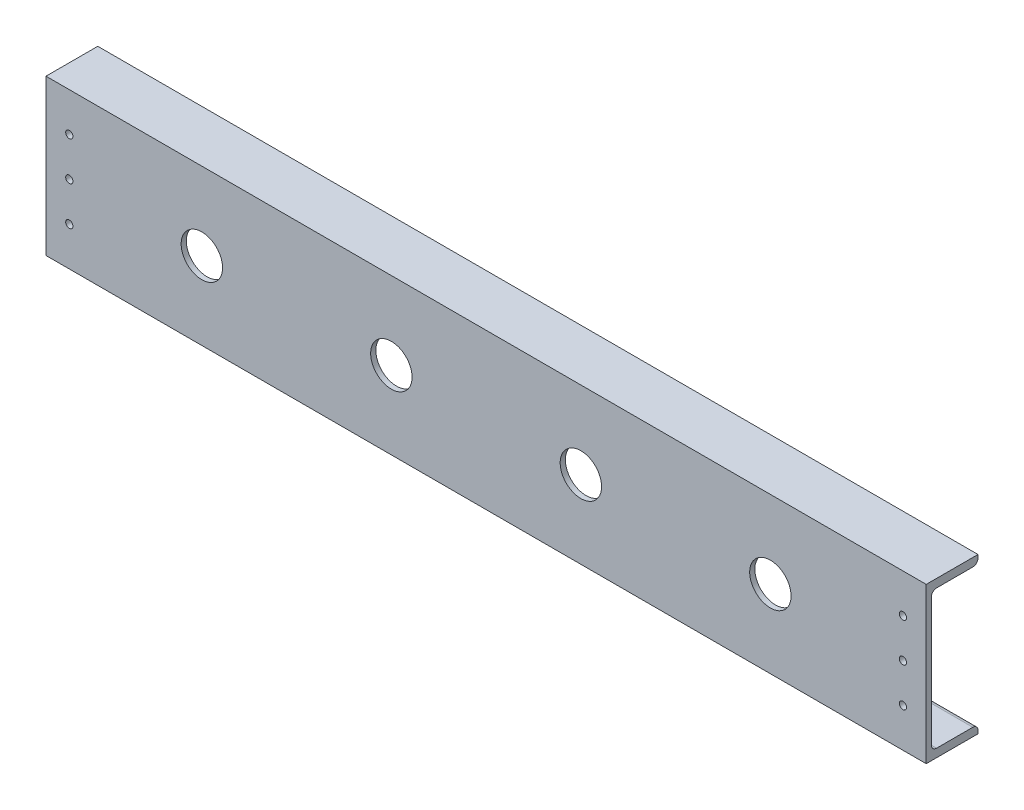
ISO-10303-21;
HEADER;
FILE_DESCRIPTION(('STEP AP214'),'2;1');
FILE_NAME('part.step','',(''),(''),'','','');
FILE_SCHEMA(('AUTOMOTIVE_DESIGN { 1 0 10303 214 1 1 1 1 }'));
ENDSEC;
DATA;
#1=APPLICATION_CONTEXT('core data for automotive mechanical design processes');
#2=APPLICATION_PROTOCOL_DEFINITION('international standard','automotive_design',2000,#1);
#3=PRODUCT_CONTEXT('',#1,'mechanical');
#4=PRODUCT('Part','Part','',(#3));
#5=PRODUCT_RELATED_PRODUCT_CATEGORY('part','',(#4));
#6=PRODUCT_DEFINITION_FORMATION('','',#4);
#7=PRODUCT_DEFINITION_CONTEXT('part definition',#1,'design');
#8=PRODUCT_DEFINITION('design','',#6,#7);
#9=PRODUCT_DEFINITION_SHAPE('','',#8);
#10=(LENGTH_UNIT() NAMED_UNIT(*) SI_UNIT(.MILLI.,.METRE.));
#11=(NAMED_UNIT(*) PLANE_ANGLE_UNIT() SI_UNIT($,.RADIAN.));
#12=(NAMED_UNIT(*) SI_UNIT($,.STERADIAN.) SOLID_ANGLE_UNIT());
#13=UNCERTAINTY_MEASURE_WITH_UNIT(LENGTH_MEASURE(1.E-05),#10,'distance_accuracy_value','');
#14=(GEOMETRIC_REPRESENTATION_CONTEXT(3) GLOBAL_UNCERTAINTY_ASSIGNED_CONTEXT((#13)) GLOBAL_UNIT_ASSIGNED_CONTEXT((#10,
#11,#12)) REPRESENTATION_CONTEXT('',''));
#15=CARTESIAN_POINT('',(0.,0.,0.));
#16=DIRECTION('',(0.,0.,1.));
#17=DIRECTION('',(1.,0.,0.));
#18=AXIS2_PLACEMENT_3D('',#15,#16,#17);
#19=CARTESIAN_POINT('',(301.,-36.1204013377926,206.622073578595));
#20=DIRECTION('',(0.,0.,-1.));
#21=DIRECTION('',(0.,1.,0.));
#22=AXIS2_PLACEMENT_3D('',#19,#20,#21);
#23=CYLINDRICAL_SURFACE('',#22,39.9999999999999);
#24=CARTESIAN_POINT('',(301.,-36.1204013377926,176.622073578595));
#25=DIRECTION('',(0.,0.,-1.));
#26=DIRECTION('',(0.,1.,0.));
#27=AXIS2_PLACEMENT_3D('',#24,#25,#26);
#28=CIRCLE('',#27,39.9999999999999);
#29=CARTESIAN_POINT('',(301.,3.87959866220729,176.622073578595));
#30=VERTEX_POINT('',#29);
#31=EDGE_CURVE('E40',#30,#30,#28,.T.);
#32=ORIENTED_EDGE('',*,*,#31,.T.);
#33=EDGE_LOOP('',(#32));
#34=FACE_BOUND('',#33,.T.);
#35=CARTESIAN_POINT('',(301.,-36.1204013377926,186.622073578595));
#36=DIRECTION('',(0.,0.,-1.));
#37=DIRECTION('',(-1.,0.,0.));
#38=AXIS2_PLACEMENT_3D('',#35,#36,#37);
#39=CIRCLE('',#38,39.9999999999999);
#40=CARTESIAN_POINT('',(261.,-36.1204013377926,186.622073578595));
#41=VERTEX_POINT('',#40);
#42=EDGE_CURVE('E11',#41,#41,#39,.T.);
#43=ORIENTED_EDGE('',*,*,#42,.F.);
#44=EDGE_LOOP('',(#43));
#45=FACE_BOUND('',#44,.T.);
#46=ADVANCED_FACE('F32',(#34,#45),#23,.F.);
#47=CARTESIAN_POINT('',(667.,-36.1204013377926,206.622073578595));
#48=DIRECTION('',(0.,0.,-1.));
#49=DIRECTION('',(0.,1.,0.));
#50=AXIS2_PLACEMENT_3D('',#47,#48,#49);
#51=CYLINDRICAL_SURFACE('',#50,39.9999999999999);
#52=CARTESIAN_POINT('',(667.,-36.1204013377926,176.622073578595));
#53=DIRECTION('',(0.,0.,-1.));
#54=DIRECTION('',(0.,1.,0.));
#55=AXIS2_PLACEMENT_3D('',#52,#53,#54);
#56=CIRCLE('',#55,39.9999999999999);
#57=CARTESIAN_POINT('',(667.,3.87959866220729,176.622073578595));
#58=VERTEX_POINT('',#57);
#59=EDGE_CURVE('E203',#58,#58,#56,.T.);
#60=ORIENTED_EDGE('',*,*,#59,.T.);
#61=EDGE_LOOP('',(#60));
#62=FACE_BOUND('',#61,.T.);
#63=CARTESIAN_POINT('',(667.,-36.1204013377926,186.622073578595));
#64=DIRECTION('',(0.,0.,-1.));
#65=DIRECTION('',(-1.,0.,0.));
#66=AXIS2_PLACEMENT_3D('',#63,#64,#65);
#67=CIRCLE('',#66,39.9999999999999);
#68=CARTESIAN_POINT('',(627.,-36.1204013377926,186.622073578595));
#69=VERTEX_POINT('',#68);
#70=EDGE_CURVE('E206',#69,#69,#67,.T.);
#71=ORIENTED_EDGE('',*,*,#70,.F.);
#72=EDGE_LOOP('',(#71));
#73=FACE_BOUND('',#72,.T.);
#74=ADVANCED_FACE('F231',(#62,#73),#51,.F.);
#75=CARTESIAN_POINT('',(1700.,107.879598662207,86.6220735785954));
#76=DIRECTION('',(0.,0.,1.));
#77=DIRECTION('',(1.,0.,0.));
#78=AXIS2_PLACEMENT_3D('',#75,#76,#77);
#79=PLANE('',#78);
#80=DIRECTION('',(0.,1.,0.));
#81=VECTOR('',#80,1.);
#82=CARTESIAN_POINT('',(0.,107.879598662207,86.6220735785954));
#83=LINE('',#82,#81);
#84=CARTESIAN_POINT('',(0.,107.879598662207,86.6220735785954));
#85=VERTEX_POINT('',#84);
#86=CARTESIAN_POINT('',(0.,113.879598662207,86.6220735785954));
#87=VERTEX_POINT('',#86);
#88=EDGE_CURVE('E153',#85,#87,#83,.T.);
#89=ORIENTED_EDGE('',*,*,#88,.T.);
#90=DIRECTION('',(-1.,0.,0.));
#91=VECTOR('',#90,1.);
#92=CARTESIAN_POINT('',(1700.,113.879598662207,86.6220735785954));
#93=LINE('',#92,#91);
#94=CARTESIAN_POINT('',(1700.,113.879598662207,86.6220735785954));
#95=VERTEX_POINT('',#94);
#96=EDGE_CURVE('E201',#95,#87,#93,.T.);
#97=ORIENTED_EDGE('',*,*,#96,.F.);
#98=DIRECTION('',(0.,1.,0.));
#99=VECTOR('',#98,1.);
#100=CARTESIAN_POINT('',(1700.,107.879598662207,86.6220735785954));
#101=LINE('',#100,#99);
#102=CARTESIAN_POINT('',(1700.,107.879598662207,86.6220735785954));
#103=VERTEX_POINT('',#102);
#104=EDGE_CURVE('E176',#103,#95,#101,.T.);
#105=ORIENTED_EDGE('',*,*,#104,.F.);
#106=DIRECTION('',(-1.,0.,0.));
#107=VECTOR('',#106,1.);
#108=CARTESIAN_POINT('',(1700.,107.879598662207,86.6220735785954));
#109=LINE('',#108,#107);
#110=EDGE_CURVE('E149',#103,#85,#109,.T.);
#111=ORIENTED_EDGE('',*,*,#110,.T.);
#112=EDGE_LOOP('',(#89,#97,#105,#111));
#113=FACE_BOUND('',#112,.T.);
#114=ADVANCED_FACE('F236',(#113),#79,.F.);
#115=CARTESIAN_POINT('',(1700.,113.879598662207,86.6220735785954));
#116=DIRECTION('',(0.,-1.,0.));
#117=DIRECTION('',(0.,0.,-1.));
#118=AXIS2_PLACEMENT_3D('',#115,#116,#117);
#119=PLANE('',#118);
#120=DIRECTION('',(0.,0.,1.));
#121=VECTOR('',#120,1.);
#122=CARTESIAN_POINT('',(0.,113.879598662207,86.6220735785954));
#123=LINE('',#122,#121);
#124=CARTESIAN_POINT('',(0.,113.879598662207,186.622073578595));
#125=VERTEX_POINT('',#124);
#126=EDGE_CURVE('E156',#87,#125,#123,.T.);
#127=ORIENTED_EDGE('',*,*,#126,.T.);
#128=DIRECTION('',(-1.,0.,0.));
#129=VECTOR('',#128,1.);
#130=CARTESIAN_POINT('',(1700.,113.879598662207,186.622073578595));
#131=LINE('',#130,#129);
#132=CARTESIAN_POINT('',(1700.,113.879598662207,186.622073578595));
#133=VERTEX_POINT('',#132);
#134=EDGE_CURVE('E198',#133,#125,#131,.T.);
#135=ORIENTED_EDGE('',*,*,#134,.F.);
#136=DIRECTION('',(0.,0.,1.));
#137=VECTOR('',#136,1.);
#138=CARTESIAN_POINT('',(1700.,113.879598662207,86.6220735785954));
#139=LINE('',#138,#137);
#140=EDGE_CURVE('E104',#95,#133,#139,.T.);
#141=ORIENTED_EDGE('',*,*,#140,.F.);
#142=ORIENTED_EDGE('',*,*,#96,.T.);
#143=EDGE_LOOP('',(#127,#135,#141,#142));
#144=FACE_BOUND('',#143,.T.);
#145=ADVANCED_FACE('F242',(#144),#119,.F.);
#146=CARTESIAN_POINT('',(1700.,113.879598662207,186.622073578595));
#147=DIRECTION('',(0.,0.,-1.));
#148=DIRECTION('',(-1.,0.,0.));
#149=AXIS2_PLACEMENT_3D('',#146,#147,#148);
#150=PLANE('',#149);
#151=CARTESIAN_POINT('',(1033.,-36.1204013377926,186.622073578595));
#152=DIRECTION('',(0.,0.,-1.));
#153=DIRECTION('',(-1.,0.,0.));
#154=AXIS2_PLACEMENT_3D('',#151,#152,#153);
#155=CIRCLE('',#154,39.9999999999999);
#156=CARTESIAN_POINT('',(993.,-36.1204013377926,186.622073578595));
#157=VERTEX_POINT('',#156);
#158=EDGE_CURVE('E338',#157,#157,#155,.T.);
#159=ORIENTED_EDGE('',*,*,#158,.T.);
#160=EDGE_LOOP('',(#159));
#161=FACE_BOUND('',#160,.T.);
#162=CARTESIAN_POINT('',(1399.,-36.1204013377926,186.622073578595));
#163=DIRECTION('',(0.,0.,-1.));
#164=DIRECTION('',(-1.,0.,0.));
#165=AXIS2_PLACEMENT_3D('',#162,#163,#164);
#166=CIRCLE('',#165,39.9999999999999);
#167=CARTESIAN_POINT('',(1359.,-36.1204013377926,186.622073578595));
#168=VERTEX_POINT('',#167);
#169=EDGE_CURVE('E319',#168,#168,#166,.T.);
#170=ORIENTED_EDGE('',*,*,#169,.T.);
#171=EDGE_LOOP('',(#170));
#172=FACE_BOUND('',#171,.T.);
#173=CARTESIAN_POINT('',(44.9999999999999,38.8795986622074,186.622073578595));
#174=DIRECTION('',(0.,0.,-1.));
#175=DIRECTION('',(-1.,0.,0.));
#176=AXIS2_PLACEMENT_3D('',#173,#174,#175);
#177=CIRCLE('',#176,6.99999999999993);
#178=CARTESIAN_POINT('',(38.,38.8795986622074,186.622073578595));
#179=VERTEX_POINT('',#178);
#180=EDGE_CURVE('E328',#179,#179,#177,.T.);
#181=ORIENTED_EDGE('',*,*,#180,.T.);
#182=EDGE_LOOP('',(#181));
#183=FACE_BOUND('',#182,.T.);
#184=CARTESIAN_POINT('',(45.0000000000001,-36.1204013377926,186.622073578595));
#185=DIRECTION('',(0.,0.,-1.));
#186=DIRECTION('',(-1.,0.,0.));
#187=AXIS2_PLACEMENT_3D('',#184,#185,#186);
#188=CIRCLE('',#187,6.99999999999993);
#189=CARTESIAN_POINT('',(38.0000000000002,-36.1204013377926,186.622073578595));
#190=VERTEX_POINT('',#189);
#191=EDGE_CURVE('E322',#190,#190,#188,.T.);
#192=ORIENTED_EDGE('',*,*,#191,.T.);
#193=EDGE_LOOP('',(#192));
#194=FACE_BOUND('',#193,.T.);
#195=CARTESIAN_POINT('',(44.9999999999999,-111.120401337793,186.622073578595));
#196=DIRECTION('',(0.,0.,-1.));
#197=DIRECTION('',(-1.,0.,0.));
#198=AXIS2_PLACEMENT_3D('',#195,#196,#197);
#199=CIRCLE('',#198,6.99999999999992);
#200=CARTESIAN_POINT('',(38.,-111.120401337793,186.622073578595));
#201=VERTEX_POINT('',#200);
#202=EDGE_CURVE('E315',#201,#201,#199,.T.);
#203=ORIENTED_EDGE('',*,*,#202,.T.);
#204=EDGE_LOOP('',(#203));
#205=FACE_BOUND('',#204,.T.);
#206=CARTESIAN_POINT('',(1655.,38.8795986622074,186.622073578595));
#207=DIRECTION('',(0.,0.,1.));
#208=DIRECTION('',(1.,0.,0.));
#209=AXIS2_PLACEMENT_3D('',#206,#207,#208);
#210=CIRCLE('',#209,6.99999999999993);
#211=CARTESIAN_POINT('',(1662.,38.8795986622074,186.622073578595));
#212=VERTEX_POINT('',#211);
#213=EDGE_CURVE('E310',#212,#212,#210,.T.);
#214=ORIENTED_EDGE('',*,*,#213,.F.);
#215=EDGE_LOOP('',(#214));
#216=FACE_BOUND('',#215,.T.);
#217=CARTESIAN_POINT('',(1655.,-36.1204013377926,186.622073578595));
#218=DIRECTION('',(0.,0.,1.));
#219=DIRECTION('',(1.,0.,0.));
#220=AXIS2_PLACEMENT_3D('',#217,#218,#219);
#221=CIRCLE('',#220,6.99999999999993);
#222=CARTESIAN_POINT('',(1662.,-36.1204013377926,186.622073578595));
#223=VERTEX_POINT('',#222);
#224=EDGE_CURVE('E304',#223,#223,#221,.T.);
#225=ORIENTED_EDGE('',*,*,#224,.F.);
#226=EDGE_LOOP('',(#225));
#227=FACE_BOUND('',#226,.T.);
#228=CARTESIAN_POINT('',(1655.,-111.120401337793,186.622073578595));
#229=DIRECTION('',(0.,0.,1.));
#230=DIRECTION('',(1.,0.,0.));
#231=AXIS2_PLACEMENT_3D('',#228,#229,#230);
#232=CIRCLE('',#231,6.99999999999992);
#233=CARTESIAN_POINT('',(1662.,-111.120401337793,186.622073578595));
#234=VERTEX_POINT('',#233);
#235=EDGE_CURVE('E297',#234,#234,#232,.T.);
#236=ORIENTED_EDGE('',*,*,#235,.F.);
#237=EDGE_LOOP('',(#236));
#238=FACE_BOUND('',#237,.T.);
#239=DIRECTION('',(0.,-1.,0.));
#240=VECTOR('',#239,1.);
#241=CARTESIAN_POINT('',(0.,113.879598662207,186.622073578595));
#242=LINE('',#241,#240);
#243=CARTESIAN_POINT('',(0.,-186.120401337793,186.622073578595));
#244=VERTEX_POINT('',#243);
#245=EDGE_CURVE('E159',#125,#244,#242,.T.);
#246=ORIENTED_EDGE('',*,*,#245,.T.);
#247=DIRECTION('',(-1.,0.,0.));
#248=VECTOR('',#247,1.);
#249=CARTESIAN_POINT('',(1700.,-186.120401337793,186.622073578595));
#250=LINE('',#249,#248);
#251=CARTESIAN_POINT('',(1700.,-186.120401337793,186.622073578595));
#252=VERTEX_POINT('',#251);
#253=EDGE_CURVE('E195',#252,#244,#250,.T.);
#254=ORIENTED_EDGE('',*,*,#253,.F.);
#255=DIRECTION('',(0.,-1.,0.));
#256=VECTOR('',#255,1.);
#257=CARTESIAN_POINT('',(1700.,113.879598662207,186.622073578595));
#258=LINE('',#257,#256);
#259=EDGE_CURVE('E293',#133,#252,#258,.T.);
#260=ORIENTED_EDGE('',*,*,#259,.F.);
#261=ORIENTED_EDGE('',*,*,#134,.T.);
#262=EDGE_LOOP('',(#246,#254,#260,#261));
#263=FACE_BOUND('',#262,.T.);
#264=ORIENTED_EDGE('',*,*,#70,.T.);
#265=EDGE_LOOP('',(#264));
#266=FACE_BOUND('',#265,.T.);
#267=ORIENTED_EDGE('',*,*,#42,.T.);
#268=EDGE_LOOP('',(#267));
#269=FACE_BOUND('',#268,.T.);
#270=ADVANCED_FACE('F249',(#161,#172,#183,#194,#205,#216,#227,#238,#263,#266,#269),#150,.F.);
#271=CARTESIAN_POINT('',(1700.,-186.120401337793,186.622073578595));
#272=DIRECTION('',(0.,1.,0.));
#273=DIRECTION('',(0.,0.,1.));
#274=AXIS2_PLACEMENT_3D('',#271,#272,#273);
#275=PLANE('',#274);
#276=DIRECTION('',(0.,0.,-1.));
#277=VECTOR('',#276,1.);
#278=CARTESIAN_POINT('',(0.,-186.120401337793,186.622073578595));
#279=LINE('',#278,#277);
#280=CARTESIAN_POINT('',(0.,-186.120401337793,86.6220735785954));
#281=VERTEX_POINT('',#280);
#282=EDGE_CURVE('E161',#244,#281,#279,.T.);
#283=ORIENTED_EDGE('',*,*,#282,.T.);
#284=DIRECTION('',(-1.,0.,0.));
#285=VECTOR('',#284,1.);
#286=CARTESIAN_POINT('',(1700.,-186.120401337793,86.6220735785954));
#287=LINE('',#286,#285);
#288=CARTESIAN_POINT('',(1700.,-186.120401337793,86.6220735785954));
#289=VERTEX_POINT('',#288);
#290=EDGE_CURVE('E192',#289,#281,#287,.T.);
#291=ORIENTED_EDGE('',*,*,#290,.F.);
#292=DIRECTION('',(0.,0.,-1.));
#293=VECTOR('',#292,1.);
#294=CARTESIAN_POINT('',(1700.,-186.120401337793,186.622073578595));
#295=LINE('',#294,#293);
#296=EDGE_CURVE('E291',#252,#289,#295,.T.);
#297=ORIENTED_EDGE('',*,*,#296,.F.);
#298=ORIENTED_EDGE('',*,*,#253,.T.);
#299=EDGE_LOOP('',(#283,#291,#297,#298));
#300=FACE_BOUND('',#299,.T.);
#301=ADVANCED_FACE('F251',(#300),#275,.F.);
#302=CARTESIAN_POINT('',(1700.,-186.120401337793,86.6220735785954));
#303=DIRECTION('',(0.,0.,1.));
#304=DIRECTION('',(1.,0.,0.));
#305=AXIS2_PLACEMENT_3D('',#302,#303,#304);
#306=PLANE('',#305);
#307=DIRECTION('',(0.,1.,0.));
#308=VECTOR('',#307,1.);
#309=CARTESIAN_POINT('',(0.,-186.120401337793,86.6220735785954));
#310=LINE('',#309,#308);
#311=CARTESIAN_POINT('',(0.,-180.120401337793,86.6220735785954));
#312=VERTEX_POINT('',#311);
#313=EDGE_CURVE('E163',#281,#312,#310,.T.);
#314=ORIENTED_EDGE('',*,*,#313,.T.);
#315=DIRECTION('',(-1.,0.,0.));
#316=VECTOR('',#315,1.);
#317=CARTESIAN_POINT('',(1700.,-180.120401337793,86.6220735785954));
#318=LINE('',#317,#316);
#319=CARTESIAN_POINT('',(1700.,-180.120401337793,86.6220735785954));
#320=VERTEX_POINT('',#319);
#321=EDGE_CURVE('E189',#320,#312,#318,.T.);
#322=ORIENTED_EDGE('',*,*,#321,.F.);
#323=DIRECTION('',(0.,1.,0.));
#324=VECTOR('',#323,1.);
#325=CARTESIAN_POINT('',(1700.,-186.120401337793,86.6220735785954));
#326=LINE('',#325,#324);
#327=EDGE_CURVE('E289',#289,#320,#326,.T.);
#328=ORIENTED_EDGE('',*,*,#327,.F.);
#329=ORIENTED_EDGE('',*,*,#290,.T.);
#330=EDGE_LOOP('',(#314,#322,#328,#329));
#331=FACE_BOUND('',#330,.T.);
#332=ADVANCED_FACE('F255',(#331),#306,.F.);
#333=CARTESIAN_POINT('',(1700.,-180.120401337793,96.6220735785954));
#334=DIRECTION('',(-1.,0.,0.));
#335=DIRECTION('',(0.,0.,1.));
#336=AXIS2_PLACEMENT_3D('',#333,#334,#335);
#337=CYLINDRICAL_SURFACE('',#336,10.);
#338=CARTESIAN_POINT('',(0.,-180.120401337793,96.6220735785954));
#339=DIRECTION('',(1.,0.,0.));
#340=DIRECTION('',(0.,0.,-1.));
#341=AXIS2_PLACEMENT_3D('',#338,#339,#340);
#342=CIRCLE('',#341,10.);
#343=CARTESIAN_POINT('',(0.,-170.120401337793,96.6220735785954));
#344=VERTEX_POINT('',#343);
#345=EDGE_CURVE('E165',#312,#344,#342,.T.);
#346=ORIENTED_EDGE('',*,*,#345,.T.);
#347=DIRECTION('',(-1.,0.,0.));
#348=VECTOR('',#347,1.);
#349=CARTESIAN_POINT('',(1700.,-170.120401337793,96.6220735785954));
#350=LINE('',#349,#348);
#351=CARTESIAN_POINT('',(1700.,-170.120401337793,96.6220735785954));
#352=VERTEX_POINT('',#351);
#353=EDGE_CURVE('E186',#352,#344,#350,.T.);
#354=ORIENTED_EDGE('',*,*,#353,.F.);
#355=CARTESIAN_POINT('',(1700.,-180.120401337793,96.6220735785954));
#356=DIRECTION('',(1.,0.,0.));
#357=DIRECTION('',(0.,0.,-1.));
#358=AXIS2_PLACEMENT_3D('',#355,#356,#357);
#359=CIRCLE('',#358,10.);
#360=EDGE_CURVE('E287',#320,#352,#359,.T.);
#361=ORIENTED_EDGE('',*,*,#360,.F.);
#362=ORIENTED_EDGE('',*,*,#321,.T.);
#363=EDGE_LOOP('',(#346,#354,#361,#362));
#364=FACE_BOUND('',#363,.T.);
#365=ADVANCED_FACE('F259',(#364),#337,.T.);
#366=CARTESIAN_POINT('',(1700.,-170.120401337793,96.6220735785954));
#367=DIRECTION('',(0.,-1.,0.));
#368=DIRECTION('',(0.,0.,-1.));
#369=AXIS2_PLACEMENT_3D('',#366,#367,#368);
#370=PLANE('',#369);
#371=DIRECTION('',(0.,0.,1.));
#372=VECTOR('',#371,1.);
#373=CARTESIAN_POINT('',(0.,-170.120401337793,96.6220735785954));
#374=LINE('',#373,#372);
#375=CARTESIAN_POINT('',(0.,-170.120401337793,166.622073578595));
#376=VERTEX_POINT('',#375);
#377=EDGE_CURVE('E167',#344,#376,#374,.T.);
#378=ORIENTED_EDGE('',*,*,#377,.T.);
#379=DIRECTION('',(-1.,0.,0.));
#380=VECTOR('',#379,1.);
#381=CARTESIAN_POINT('',(1700.,-170.120401337793,166.622073578595));
#382=LINE('',#381,#380);
#383=CARTESIAN_POINT('',(1700.,-170.120401337793,166.622073578595));
#384=VERTEX_POINT('',#383);
#385=EDGE_CURVE('E183',#384,#376,#382,.T.);
#386=ORIENTED_EDGE('',*,*,#385,.F.);
#387=DIRECTION('',(0.,0.,1.));
#388=VECTOR('',#387,1.);
#389=CARTESIAN_POINT('',(1700.,-170.120401337793,96.6220735785954));
#390=LINE('',#389,#388);
#391=EDGE_CURVE('E283',#352,#384,#390,.T.);
#392=ORIENTED_EDGE('',*,*,#391,.F.);
#393=ORIENTED_EDGE('',*,*,#353,.T.);
#394=EDGE_LOOP('',(#378,#386,#392,#393));
#395=FACE_BOUND('',#394,.T.);
#396=ADVANCED_FACE('F225',(#395),#370,.F.);
#397=CARTESIAN_POINT('',(1700.,-160.120401337793,166.622073578595));
#398=DIRECTION('',(-1.,0.,0.));
#399=DIRECTION('',(0.,0.,1.));
#400=AXIS2_PLACEMENT_3D('',#397,#398,#399);
#401=CYLINDRICAL_SURFACE('',#400,10.);
#402=CARTESIAN_POINT('',(0.,-160.120401337793,166.622073578595));
#403=DIRECTION('',(-1.,0.,0.));
#404=DIRECTION('',(0.,0.,1.));
#405=AXIS2_PLACEMENT_3D('',#402,#403,#404);
#406=CIRCLE('',#405,10.);
#407=CARTESIAN_POINT('',(0.,-160.120401337793,176.622073578595));
#408=VERTEX_POINT('',#407);
#409=EDGE_CURVE('E169',#376,#408,#406,.T.);
#410=ORIENTED_EDGE('',*,*,#409,.T.);
#411=DIRECTION('',(-1.,0.,0.));
#412=VECTOR('',#411,1.);
#413=CARTESIAN_POINT('',(1700.,-160.120401337793,176.622073578595));
#414=LINE('',#413,#412);
#415=CARTESIAN_POINT('',(1700.,-160.120401337793,176.622073578595));
#416=VERTEX_POINT('',#415);
#417=EDGE_CURVE('E180',#416,#408,#414,.T.);
#418=ORIENTED_EDGE('',*,*,#417,.F.);
#419=CARTESIAN_POINT('',(1700.,-160.120401337793,166.622073578595));
#420=DIRECTION('',(-1.,0.,0.));
#421=DIRECTION('',(0.,0.,1.));
#422=AXIS2_PLACEMENT_3D('',#419,#420,#421);
#423=CIRCLE('',#422,10.);
#424=EDGE_CURVE('E277',#384,#416,#423,.T.);
#425=ORIENTED_EDGE('',*,*,#424,.F.);
#426=ORIENTED_EDGE('',*,*,#385,.T.);
#427=EDGE_LOOP('',(#410,#418,#425,#426));
#428=FACE_BOUND('',#427,.T.);
#429=ADVANCED_FACE('F215',(#428),#401,.F.);
#430=CARTESIAN_POINT('',(1700.,-160.120401337793,176.622073578595));
#431=DIRECTION('',(0.,0.,1.));
#432=DIRECTION('',(0.,-1.,0.));
#433=AXIS2_PLACEMENT_3D('',#430,#431,#432);
#434=PLANE('',#433);
#435=CARTESIAN_POINT('',(1033.,-36.1204013377926,176.622073578595));
#436=DIRECTION('',(0.,0.,-1.));
#437=DIRECTION('',(0.,1.,0.));
#438=AXIS2_PLACEMENT_3D('',#435,#436,#437);
#439=CIRCLE('',#438,39.9999999999999);
#440=CARTESIAN_POINT('',(1033.,3.87959866220729,176.622073578595));
#441=VERTEX_POINT('',#440);
#442=EDGE_CURVE('E341',#441,#441,#439,.T.);
#443=ORIENTED_EDGE('',*,*,#442,.F.);
#444=EDGE_LOOP('',(#443));
#445=FACE_BOUND('',#444,.T.);
#446=CARTESIAN_POINT('',(1399.,-36.1204013377926,176.622073578595));
#447=DIRECTION('',(0.,0.,-1.));
#448=DIRECTION('',(0.,1.,0.));
#449=AXIS2_PLACEMENT_3D('',#446,#447,#448);
#450=CIRCLE('',#449,39.9999999999999);
#451=CARTESIAN_POINT('',(1399.,3.87959866220729,176.622073578595));
#452=VERTEX_POINT('',#451);
#453=EDGE_CURVE('E335',#452,#452,#450,.T.);
#454=ORIENTED_EDGE('',*,*,#453,.F.);
#455=EDGE_LOOP('',(#454));
#456=FACE_BOUND('',#455,.T.);
#457=CARTESIAN_POINT('',(44.9999999999999,38.8795986622074,176.622073578595));
#458=DIRECTION('',(0.,0.,-1.));
#459=DIRECTION('',(-1.,0.,0.));
#460=AXIS2_PLACEMENT_3D('',#457,#458,#459);
#461=CIRCLE('',#460,6.99999999999993);
#462=CARTESIAN_POINT('',(38.,38.8795986622074,176.622073578595));
#463=VERTEX_POINT('',#462);
#464=EDGE_CURVE('E301',#463,#463,#461,.T.);
#465=ORIENTED_EDGE('',*,*,#464,.F.);
#466=EDGE_LOOP('',(#465));
#467=FACE_BOUND('',#466,.T.);
#468=CARTESIAN_POINT('',(45.0000000000001,-36.1204013377926,176.622073578595));
#469=DIRECTION('',(0.,0.,-1.));
#470=DIRECTION('',(-1.,0.,0.));
#471=AXIS2_PLACEMENT_3D('',#468,#469,#470);
#472=CIRCLE('',#471,6.99999999999993);
#473=CARTESIAN_POINT('',(38.0000000000002,-36.1204013377926,176.622073578595));
#474=VERTEX_POINT('',#473);
#475=EDGE_CURVE('E325',#474,#474,#472,.T.);
#476=ORIENTED_EDGE('',*,*,#475,.F.);
#477=EDGE_LOOP('',(#476));
#478=FACE_BOUND('',#477,.T.);
#479=CARTESIAN_POINT('',(44.9999999999999,-111.120401337793,176.622073578595));
#480=DIRECTION('',(0.,0.,-1.));
#481=DIRECTION('',(-1.,0.,0.));
#482=AXIS2_PLACEMENT_3D('',#479,#480,#481);
#483=CIRCLE('',#482,6.99999999999992);
#484=CARTESIAN_POINT('',(38.,-111.120401337793,176.622073578595));
#485=VERTEX_POINT('',#484);
#486=EDGE_CURVE('E318',#485,#485,#483,.T.);
#487=ORIENTED_EDGE('',*,*,#486,.F.);
#488=EDGE_LOOP('',(#487));
#489=FACE_BOUND('',#488,.T.);
#490=CARTESIAN_POINT('',(1655.,38.8795986622074,176.622073578595));
#491=DIRECTION('',(0.,0.,1.));
#492=DIRECTION('',(1.,0.,0.));
#493=AXIS2_PLACEMENT_3D('',#490,#491,#492);
#494=CIRCLE('',#493,6.99999999999993);
#495=CARTESIAN_POINT('',(1662.,38.8795986622074,176.622073578595));
#496=VERTEX_POINT('',#495);
#497=EDGE_CURVE('E157',#496,#496,#494,.T.);
#498=ORIENTED_EDGE('',*,*,#497,.T.);
#499=EDGE_LOOP('',(#498));
#500=FACE_BOUND('',#499,.T.);
#501=CARTESIAN_POINT('',(1655.,-36.1204013377926,176.622073578595));
#502=DIRECTION('',(0.,0.,1.));
#503=DIRECTION('',(1.,0.,0.));
#504=AXIS2_PLACEMENT_3D('',#501,#502,#503);
#505=CIRCLE('',#504,6.99999999999993);
#506=CARTESIAN_POINT('',(1662.,-36.1204013377926,176.622073578595));
#507=VERTEX_POINT('',#506);
#508=EDGE_CURVE('E307',#507,#507,#505,.T.);
#509=ORIENTED_EDGE('',*,*,#508,.T.);
#510=EDGE_LOOP('',(#509));
#511=FACE_BOUND('',#510,.T.);
#512=CARTESIAN_POINT('',(1655.,-111.120401337793,176.622073578595));
#513=DIRECTION('',(0.,0.,1.));
#514=DIRECTION('',(1.,0.,0.));
#515=AXIS2_PLACEMENT_3D('',#512,#513,#514);
#516=CIRCLE('',#515,6.99999999999992);
#517=CARTESIAN_POINT('',(1662.,-111.120401337793,176.622073578595));
#518=VERTEX_POINT('',#517);
#519=EDGE_CURVE('E300',#518,#518,#516,.T.);
#520=ORIENTED_EDGE('',*,*,#519,.T.);
#521=EDGE_LOOP('',(#520));
#522=FACE_BOUND('',#521,.T.);
#523=DIRECTION('',(0.,1.,0.));
#524=VECTOR('',#523,1.);
#525=CARTESIAN_POINT('',(0.,-160.120401337793,176.622073578595));
#526=LINE('',#525,#524);
#527=CARTESIAN_POINT('',(0.,87.8795986622073,176.622073578595));
#528=VERTEX_POINT('',#527);
#529=EDGE_CURVE('E171',#408,#528,#526,.T.);
#530=ORIENTED_EDGE('',*,*,#529,.T.);
#531=DIRECTION('',(-1.,0.,0.));
#532=VECTOR('',#531,1.);
#533=CARTESIAN_POINT('',(1700.,87.8795986622073,176.622073578595));
#534=LINE('',#533,#532);
#535=CARTESIAN_POINT('',(1700.,87.8795986622073,176.622073578595));
#536=VERTEX_POINT('',#535);
#537=EDGE_CURVE('E144',#536,#528,#534,.T.);
#538=ORIENTED_EDGE('',*,*,#537,.F.);
#539=DIRECTION('',(0.,1.,0.));
#540=VECTOR('',#539,1.);
#541=CARTESIAN_POINT('',(1700.,-160.120401337793,176.622073578595));
#542=LINE('',#541,#540);
#543=EDGE_CURVE('E135',#416,#536,#542,.T.);
#544=ORIENTED_EDGE('',*,*,#543,.F.);
#545=ORIENTED_EDGE('',*,*,#417,.T.);
#546=EDGE_LOOP('',(#530,#538,#544,#545));
#547=FACE_BOUND('',#546,.T.);
#548=ORIENTED_EDGE('',*,*,#59,.F.);
#549=EDGE_LOOP('',(#548));
#550=FACE_BOUND('',#549,.T.);
#551=ORIENTED_EDGE('',*,*,#31,.F.);
#552=EDGE_LOOP('',(#551));
#553=FACE_BOUND('',#552,.T.);
#554=ADVANCED_FACE('F213',(#445,#456,#467,#478,#489,#500,#511,#522,#547,#550,#553),#434,.F.);
#555=CARTESIAN_POINT('',(1700.,87.8795986622074,166.622073578595));
#556=DIRECTION('',(-1.,0.,0.));
#557=DIRECTION('',(0.,0.,1.));
#558=AXIS2_PLACEMENT_3D('',#555,#556,#557);
#559=CYLINDRICAL_SURFACE('',#558,10.);
#560=CARTESIAN_POINT('',(0.,87.8795986622074,166.622073578595));
#561=DIRECTION('',(-1.,0.,0.));
#562=DIRECTION('',(0.,0.,1.));
#563=AXIS2_PLACEMENT_3D('',#560,#561,#562);
#564=CIRCLE('',#563,10.);
#565=CARTESIAN_POINT('',(0.,97.8795986622074,166.622073578595));
#566=VERTEX_POINT('',#565);
#567=EDGE_CURVE('E143',#528,#566,#564,.T.);
#568=ORIENTED_EDGE('',*,*,#567,.T.);
#569=DIRECTION('',(-1.,0.,0.));
#570=VECTOR('',#569,1.);
#571=CARTESIAN_POINT('',(1700.,97.8795986622074,166.622073578595));
#572=LINE('',#571,#570);
#573=CARTESIAN_POINT('',(1700.,97.8795986622074,166.622073578595));
#574=VERTEX_POINT('',#573);
#575=EDGE_CURVE('E140',#574,#566,#572,.T.);
#576=ORIENTED_EDGE('',*,*,#575,.F.);
#577=CARTESIAN_POINT('',(1700.,87.8795986622074,166.622073578595));
#578=DIRECTION('',(-1.,0.,0.));
#579=DIRECTION('',(0.,0.,1.));
#580=AXIS2_PLACEMENT_3D('',#577,#578,#579);
#581=CIRCLE('',#580,10.);
#582=EDGE_CURVE('E129',#536,#574,#581,.T.);
#583=ORIENTED_EDGE('',*,*,#582,.F.);
#584=ORIENTED_EDGE('',*,*,#537,.T.);
#585=EDGE_LOOP('',(#568,#576,#583,#584));
#586=FACE_BOUND('',#585,.T.);
#587=ADVANCED_FACE('F141',(#586),#559,.F.);
#588=CARTESIAN_POINT('',(1700.,97.8795986622074,166.622073578595));
#589=DIRECTION('',(0.,1.,0.));
#590=DIRECTION('',(0.,0.,1.));
#591=AXIS2_PLACEMENT_3D('',#588,#589,#590);
#592=PLANE('',#591);
#593=DIRECTION('',(0.,0.,-1.));
#594=VECTOR('',#593,1.);
#595=CARTESIAN_POINT('',(0.,97.8795986622074,166.622073578595));
#596=LINE('',#595,#594);
#597=CARTESIAN_POINT('',(0.,97.8795986622074,96.6220735785955));
#598=VERTEX_POINT('',#597);
#599=EDGE_CURVE('E89',#566,#598,#596,.T.);
#600=ORIENTED_EDGE('',*,*,#599,.T.);
#601=DIRECTION('',(-1.,0.,0.));
#602=VECTOR('',#601,1.);
#603=CARTESIAN_POINT('',(1700.,97.8795986622074,96.6220735785955));
#604=LINE('',#603,#602);
#605=CARTESIAN_POINT('',(1700.,97.8795986622074,96.6220735785955));
#606=VERTEX_POINT('',#605);
#607=EDGE_CURVE('E145',#606,#598,#604,.T.);
#608=ORIENTED_EDGE('',*,*,#607,.F.);
#609=DIRECTION('',(0.,0.,-1.));
#610=VECTOR('',#609,1.);
#611=CARTESIAN_POINT('',(1700.,97.8795986622074,166.622073578595));
#612=LINE('',#611,#610);
#613=EDGE_CURVE('E133',#574,#606,#612,.T.);
#614=ORIENTED_EDGE('',*,*,#613,.F.);
#615=ORIENTED_EDGE('',*,*,#575,.T.);
#616=EDGE_LOOP('',(#600,#608,#614,#615));
#617=FACE_BOUND('',#616,.T.);
#618=ADVANCED_FACE('F147',(#617),#592,.F.);
#619=CARTESIAN_POINT('',(1700.,107.879598662207,96.6220735785954));
#620=DIRECTION('',(-1.,0.,0.));
#621=DIRECTION('',(0.,0.,1.));
#622=AXIS2_PLACEMENT_3D('',#619,#620,#621);
#623=CYLINDRICAL_SURFACE('',#622,9.99999999999999);
#624=CARTESIAN_POINT('',(0.,107.879598662207,96.6220735785954));
#625=DIRECTION('',(1.,0.,0.));
#626=DIRECTION('',(0.,0.,-1.));
#627=AXIS2_PLACEMENT_3D('',#624,#625,#626);
#628=CIRCLE('',#627,9.99999999999999);
#629=EDGE_CURVE('E95',#598,#85,#628,.T.);
#630=ORIENTED_EDGE('',*,*,#629,.T.);
#631=ORIENTED_EDGE('',*,*,#110,.F.);
#632=CARTESIAN_POINT('',(1700.,107.879598662207,96.6220735785954));
#633=DIRECTION('',(1.,0.,0.));
#634=DIRECTION('',(0.,0.,-1.));
#635=AXIS2_PLACEMENT_3D('',#632,#633,#634);
#636=CIRCLE('',#635,9.99999999999999);
#637=EDGE_CURVE('E48',#606,#103,#636,.T.);
#638=ORIENTED_EDGE('',*,*,#637,.F.);
#639=ORIENTED_EDGE('',*,*,#607,.T.);
#640=EDGE_LOOP('',(#630,#631,#638,#639));
#641=FACE_BOUND('',#640,.T.);
#642=ADVANCED_FACE('F381',(#641),#623,.T.);
#643=CARTESIAN_POINT('',(1700.,-180.120401337793,96.6220735785954));
#644=DIRECTION('',(1.,0.,0.));
#645=DIRECTION('',(0.,0.,-1.));
#646=AXIS2_PLACEMENT_3D('',#643,#644,#645);
#647=PLANE('',#646);
#648=ORIENTED_EDGE('',*,*,#104,.T.);
#649=ORIENTED_EDGE('',*,*,#140,.T.);
#650=ORIENTED_EDGE('',*,*,#259,.T.);
#651=ORIENTED_EDGE('',*,*,#296,.T.);
#652=ORIENTED_EDGE('',*,*,#327,.T.);
#653=ORIENTED_EDGE('',*,*,#360,.T.);
#654=ORIENTED_EDGE('',*,*,#391,.T.);
#655=ORIENTED_EDGE('',*,*,#424,.T.);
#656=ORIENTED_EDGE('',*,*,#543,.T.);
#657=ORIENTED_EDGE('',*,*,#582,.T.);
#658=ORIENTED_EDGE('',*,*,#613,.T.);
#659=ORIENTED_EDGE('',*,*,#637,.T.);
#660=EDGE_LOOP('',(#648,#649,#650,#651,#652,#653,#654,#655,#656,#657,#658,#659));
#661=FACE_BOUND('',#660,.T.);
#662=ADVANCED_FACE('F131',(#661),#647,.T.);
#663=CARTESIAN_POINT('',(0.,-180.120401337793,96.6220735785954));
#664=DIRECTION('',(1.,0.,0.));
#665=DIRECTION('',(0.,0.,-1.));
#666=AXIS2_PLACEMENT_3D('',#663,#664,#665);
#667=PLANE('',#666);
#668=ORIENTED_EDGE('',*,*,#88,.F.);
#669=ORIENTED_EDGE('',*,*,#629,.F.);
#670=ORIENTED_EDGE('',*,*,#599,.F.);
#671=ORIENTED_EDGE('',*,*,#567,.F.);
#672=ORIENTED_EDGE('',*,*,#529,.F.);
#673=ORIENTED_EDGE('',*,*,#409,.F.);
#674=ORIENTED_EDGE('',*,*,#377,.F.);
#675=ORIENTED_EDGE('',*,*,#345,.F.);
#676=ORIENTED_EDGE('',*,*,#313,.F.);
#677=ORIENTED_EDGE('',*,*,#282,.F.);
#678=ORIENTED_EDGE('',*,*,#245,.F.);
#679=ORIENTED_EDGE('',*,*,#126,.F.);
#680=EDGE_LOOP('',(#668,#669,#670,#671,#672,#673,#674,#675,#676,#677,#678,#679));
#681=FACE_BOUND('',#680,.T.);
#682=ADVANCED_FACE('F280',(#681),#667,.F.);
#683=CARTESIAN_POINT('',(1655.,-111.120401337793,176.622073578595));
#684=DIRECTION('',(0.,0.,1.));
#685=DIRECTION('',(1.,0.,0.));
#686=AXIS2_PLACEMENT_3D('',#683,#684,#685);
#687=CYLINDRICAL_SURFACE('',#686,6.99999999999992);
#688=ORIENTED_EDGE('',*,*,#519,.F.);
#689=EDGE_LOOP('',(#688));
#690=FACE_BOUND('',#689,.T.);
#691=ORIENTED_EDGE('',*,*,#235,.T.);
#692=EDGE_LOOP('',(#691));
#693=FACE_BOUND('',#692,.T.);
#694=ADVANCED_FACE('F391',(#690,#693),#687,.F.);
#695=CARTESIAN_POINT('',(1655.,-36.1204013377926,176.622073578595));
#696=DIRECTION('',(0.,0.,1.));
#697=DIRECTION('',(1.,0.,0.));
#698=AXIS2_PLACEMENT_3D('',#695,#696,#697);
#699=CYLINDRICAL_SURFACE('',#698,6.99999999999993);
#700=ORIENTED_EDGE('',*,*,#508,.F.);
#701=EDGE_LOOP('',(#700));
#702=FACE_BOUND('',#701,.T.);
#703=ORIENTED_EDGE('',*,*,#224,.T.);
#704=EDGE_LOOP('',(#703));
#705=FACE_BOUND('',#704,.T.);
#706=ADVANCED_FACE('F394',(#702,#705),#699,.F.);
#707=CARTESIAN_POINT('',(1655.,38.8795986622074,176.622073578595));
#708=DIRECTION('',(0.,0.,1.));
#709=DIRECTION('',(1.,0.,0.));
#710=AXIS2_PLACEMENT_3D('',#707,#708,#709);
#711=CYLINDRICAL_SURFACE('',#710,6.99999999999993);
#712=ORIENTED_EDGE('',*,*,#497,.F.);
#713=EDGE_LOOP('',(#712));
#714=FACE_BOUND('',#713,.T.);
#715=ORIENTED_EDGE('',*,*,#213,.T.);
#716=EDGE_LOOP('',(#715));
#717=FACE_BOUND('',#716,.T.);
#718=ADVANCED_FACE('F398',(#714,#717),#711,.F.);
#719=CARTESIAN_POINT('',(44.9999999999999,-111.120401337793,176.622073578595));
#720=DIRECTION('',(0.,0.,1.));
#721=DIRECTION('',(1.,0.,0.));
#722=AXIS2_PLACEMENT_3D('',#719,#720,#721);
#723=CYLINDRICAL_SURFACE('',#722,6.99999999999992);
#724=ORIENTED_EDGE('',*,*,#486,.T.);
#725=EDGE_LOOP('',(#724));
#726=FACE_BOUND('',#725,.T.);
#727=ORIENTED_EDGE('',*,*,#202,.F.);
#728=EDGE_LOOP('',(#727));
#729=FACE_BOUND('',#728,.T.);
#730=ADVANCED_FACE('F402',(#726,#729),#723,.F.);
#731=CARTESIAN_POINT('',(45.0000000000001,-36.1204013377926,176.622073578595));
#732=DIRECTION('',(0.,0.,1.));
#733=DIRECTION('',(1.,0.,0.));
#734=AXIS2_PLACEMENT_3D('',#731,#732,#733);
#735=CYLINDRICAL_SURFACE('',#734,6.99999999999993);
#736=ORIENTED_EDGE('',*,*,#475,.T.);
#737=EDGE_LOOP('',(#736));
#738=FACE_BOUND('',#737,.T.);
#739=ORIENTED_EDGE('',*,*,#191,.F.);
#740=EDGE_LOOP('',(#739));
#741=FACE_BOUND('',#740,.T.);
#742=ADVANCED_FACE('F406',(#738,#741),#735,.F.);
#743=CARTESIAN_POINT('',(44.9999999999999,38.8795986622074,176.622073578595));
#744=DIRECTION('',(0.,0.,1.));
#745=DIRECTION('',(1.,0.,0.));
#746=AXIS2_PLACEMENT_3D('',#743,#744,#745);
#747=CYLINDRICAL_SURFACE('',#746,6.99999999999993);
#748=ORIENTED_EDGE('',*,*,#464,.T.);
#749=EDGE_LOOP('',(#748));
#750=FACE_BOUND('',#749,.T.);
#751=ORIENTED_EDGE('',*,*,#180,.F.);
#752=EDGE_LOOP('',(#751));
#753=FACE_BOUND('',#752,.T.);
#754=ADVANCED_FACE('F410',(#750,#753),#747,.F.);
#755=CARTESIAN_POINT('',(1399.,-36.1204013377926,206.622073578595));
#756=DIRECTION('',(0.,0.,-1.));
#757=DIRECTION('',(0.,1.,0.));
#758=AXIS2_PLACEMENT_3D('',#755,#756,#757);
#759=CYLINDRICAL_SURFACE('',#758,39.9999999999999);
#760=ORIENTED_EDGE('',*,*,#453,.T.);
#761=EDGE_LOOP('',(#760));
#762=FACE_BOUND('',#761,.T.);
#763=ORIENTED_EDGE('',*,*,#169,.F.);
#764=EDGE_LOOP('',(#763));
#765=FACE_BOUND('',#764,.T.);
#766=ADVANCED_FACE('F347',(#762,#765),#759,.F.);
#767=CARTESIAN_POINT('',(1033.,-36.1204013377926,206.622073578595));
#768=DIRECTION('',(0.,0.,-1.));
#769=DIRECTION('',(0.,1.,0.));
#770=AXIS2_PLACEMENT_3D('',#767,#768,#769);
#771=CYLINDRICAL_SURFACE('',#770,39.9999999999999);
#772=ORIENTED_EDGE('',*,*,#442,.T.);
#773=EDGE_LOOP('',(#772));
#774=FACE_BOUND('',#773,.T.);
#775=ORIENTED_EDGE('',*,*,#158,.F.);
#776=EDGE_LOOP('',(#775));
#777=FACE_BOUND('',#776,.T.);
#778=ADVANCED_FACE('F344',(#774,#777),#771,.F.);
#779=CLOSED_SHELL('',(#46,#74,#114,#145,#270,#301,#332,#365,#396,#429,#554,#587,#618,#642,#662,
#682,#694,#706,#718,#730,#742,#754,#766,#778));
#780=MANIFOLD_SOLID_BREP('B2',#779);
#781=ADVANCED_BREP_SHAPE_REPRESENTATION('',(#18,#780),#14);
#782=SHAPE_DEFINITION_REPRESENTATION(#9,#781);
ENDSEC;
END-ISO-10303-21;
